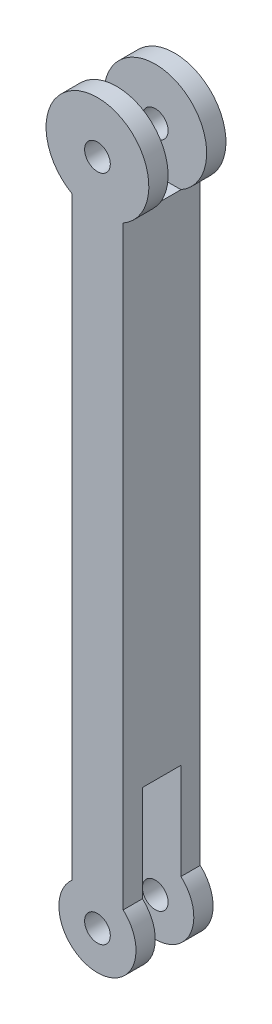
ISO-10303-21;
HEADER;
FILE_DESCRIPTION(('STEP AP214'),'2;1');
FILE_NAME('part.step','',(''),(''),'','','');
FILE_SCHEMA(('AUTOMOTIVE_DESIGN { 1 0 10303 214 1 1 1 1 }'));
ENDSEC;
DATA;
#1=APPLICATION_CONTEXT('core data for automotive mechanical design processes');
#2=APPLICATION_PROTOCOL_DEFINITION('international standard','automotive_design',2000,#1);
#3=PRODUCT_CONTEXT('',#1,'mechanical');
#4=PRODUCT('Part','Part','',(#3));
#5=PRODUCT_RELATED_PRODUCT_CATEGORY('part','',(#4));
#6=PRODUCT_DEFINITION_FORMATION('','',#4);
#7=PRODUCT_DEFINITION_CONTEXT('part definition',#1,'design');
#8=PRODUCT_DEFINITION('design','',#6,#7);
#9=PRODUCT_DEFINITION_SHAPE('','',#8);
#10=(LENGTH_UNIT() NAMED_UNIT(*) SI_UNIT(.MILLI.,.METRE.));
#11=(NAMED_UNIT(*) PLANE_ANGLE_UNIT() SI_UNIT($,.RADIAN.));
#12=(NAMED_UNIT(*) SI_UNIT($,.STERADIAN.) SOLID_ANGLE_UNIT());
#13=UNCERTAINTY_MEASURE_WITH_UNIT(LENGTH_MEASURE(1.E-05),#10,'distance_accuracy_value','');
#14=(GEOMETRIC_REPRESENTATION_CONTEXT(3) GLOBAL_UNCERTAINTY_ASSIGNED_CONTEXT((#13)) GLOBAL_UNIT_ASSIGNED_CONTEXT((#10,
#11,#12)) REPRESENTATION_CONTEXT('',''));
#15=CARTESIAN_POINT('',(0.,0.,0.));
#16=DIRECTION('',(0.,0.,1.));
#17=DIRECTION('',(1.,0.,0.));
#18=AXIS2_PLACEMENT_3D('',#15,#16,#17);
#19=CARTESIAN_POINT('',(0.,53.2280336376379,12.));
#20=DIRECTION('',(0.,0.,-1.));
#21=DIRECTION('',(-1.,0.,0.));
#22=AXIS2_PLACEMENT_3D('',#19,#20,#21);
#23=CYLINDRICAL_SURFACE('',#22,8.);
#24=CARTESIAN_POINT('',(0.,53.2280336376379,9.));
#25=DIRECTION('',(0.,0.,-1.));
#26=DIRECTION('',(-1.,0.,0.));
#27=AXIS2_PLACEMENT_3D('',#24,#25,#26);
#28=CIRCLE('',#27,8.);
#29=CARTESIAN_POINT('',(-4.00000000000001,46.2998304073624,9.));
#30=VERTEX_POINT('',#29);
#31=CARTESIAN_POINT('',(4.00000000000001,46.2998304073624,9.));
#32=VERTEX_POINT('',#31);
#33=EDGE_CURVE('E192',#30,#32,#28,.T.);
#34=ORIENTED_EDGE('',*,*,#33,.F.);
#35=DIRECTION('',(0.,0.,-1.));
#36=VECTOR('',#35,1.);
#37=CARTESIAN_POINT('',(-4.00000000000001,46.2998304073624,12.));
#38=LINE('',#37,#36);
#39=CARTESIAN_POINT('',(-4.00000000000001,46.2998304073624,12.));
#40=VERTEX_POINT('',#39);
#41=EDGE_CURVE('E11',#40,#30,#38,.T.);
#42=ORIENTED_EDGE('',*,*,#41,.F.);
#43=CARTESIAN_POINT('',(0.,53.2280336376379,12.));
#44=DIRECTION('',(0.,0.,1.));
#45=DIRECTION('',(-1.,0.,0.));
#46=AXIS2_PLACEMENT_3D('',#43,#44,#45);
#47=CIRCLE('',#46,8.);
#48=CARTESIAN_POINT('',(4.00000000000001,46.2998304073624,12.));
#49=VERTEX_POINT('',#48);
#50=EDGE_CURVE('E237',#49,#40,#47,.T.);
#51=ORIENTED_EDGE('',*,*,#50,.F.);
#52=DIRECTION('',(0.,0.,-1.));
#53=VECTOR('',#52,1.);
#54=CARTESIAN_POINT('',(4.00000000000001,46.2998304073624,12.));
#55=LINE('',#54,#53);
#56=EDGE_CURVE('E126',#49,#32,#55,.T.);
#57=ORIENTED_EDGE('',*,*,#56,.T.);
#58=EDGE_LOOP('',(#34,#42,#51,#57));
#59=FACE_BOUND('',#58,.T.);
#60=ADVANCED_FACE('F32',(#59),#23,.T.);
#61=CARTESIAN_POINT('',(0.,53.2280336376379,3.));
#62=DIRECTION('',(0.,0.,1.));
#63=DIRECTION('',(1.,0.,0.));
#64=AXIS2_PLACEMENT_3D('',#61,#62,#63);
#65=CIRCLE('',#64,8.);
#66=CARTESIAN_POINT('',(4.00000000000001,46.2998304073624,3.));
#67=VERTEX_POINT('',#66);
#68=CARTESIAN_POINT('',(-4.00000000000001,46.2998304073624,3.));
#69=VERTEX_POINT('',#68);
#70=EDGE_CURVE('E130',#67,#69,#65,.T.);
#71=ORIENTED_EDGE('',*,*,#70,.F.);
#72=CARTESIAN_POINT('',(4.00000000000001,46.2998304073624,0.));
#73=VERTEX_POINT('',#72);
#74=EDGE_CURVE('E79',#67,#73,#55,.T.);
#75=ORIENTED_EDGE('',*,*,#74,.T.);
#76=CARTESIAN_POINT('',(0.,53.2280336376379,0.));
#77=DIRECTION('',(0.,0.,1.));
#78=DIRECTION('',(-1.,0.,0.));
#79=AXIS2_PLACEMENT_3D('',#76,#77,#78);
#80=CIRCLE('',#79,8.);
#81=CARTESIAN_POINT('',(-4.00000000000001,46.2998304073624,0.));
#82=VERTEX_POINT('',#81);
#83=EDGE_CURVE('E234',#73,#82,#80,.T.);
#84=ORIENTED_EDGE('',*,*,#83,.T.);
#85=EDGE_CURVE('E40',#69,#82,#38,.T.);
#86=ORIENTED_EDGE('',*,*,#85,.F.);
#87=EDGE_LOOP('',(#71,#75,#84,#86));
#88=FACE_BOUND('',#87,.T.);
#89=ADVANCED_FACE('F133',(#88),#23,.T.);
#90=CARTESIAN_POINT('',(0.,53.2280336376379,0.));
#91=DIRECTION('',(0.,0.,1.));
#92=DIRECTION('',(1.,0.,0.));
#93=AXIS2_PLACEMENT_3D('',#90,#91,#92);
#94=CYLINDRICAL_SURFACE('',#93,2.);
#95=CARTESIAN_POINT('',(0.,53.2280336376379,12.));
#96=DIRECTION('',(0.,0.,1.));
#97=DIRECTION('',(1.,0.,0.));
#98=AXIS2_PLACEMENT_3D('',#95,#96,#97);
#99=CIRCLE('',#98,2.);
#100=CARTESIAN_POINT('',(2.,53.2280336376379,12.));
#101=VERTEX_POINT('',#100);
#102=EDGE_CURVE('E228',#101,#101,#99,.T.);
#103=ORIENTED_EDGE('',*,*,#102,.T.);
#104=EDGE_LOOP('',(#103));
#105=FACE_BOUND('',#104,.T.);
#106=CARTESIAN_POINT('',(0.,53.2280336376379,9.));
#107=DIRECTION('',(0.,0.,-1.));
#108=DIRECTION('',(-1.,0.,0.));
#109=AXIS2_PLACEMENT_3D('',#106,#107,#108);
#110=CIRCLE('',#109,2.);
#111=CARTESIAN_POINT('',(-2.,53.2280336376379,9.));
#112=VERTEX_POINT('',#111);
#113=EDGE_CURVE('E35',#112,#112,#110,.F.);
#114=ORIENTED_EDGE('',*,*,#113,.F.);
#115=EDGE_LOOP('',(#114));
#116=FACE_BOUND('',#115,.T.);
#117=ADVANCED_FACE('F172',(#105,#116),#94,.F.);
#118=CARTESIAN_POINT('',(0.,53.2280336376379,0.));
#119=DIRECTION('',(0.,0.,1.));
#120=DIRECTION('',(1.,0.,0.));
#121=AXIS2_PLACEMENT_3D('',#118,#119,#120);
#122=CIRCLE('',#121,2.);
#123=CARTESIAN_POINT('',(2.,53.2280336376379,0.));
#124=VERTEX_POINT('',#123);
#125=EDGE_CURVE('E231',#124,#124,#122,.T.);
#126=ORIENTED_EDGE('',*,*,#125,.F.);
#127=EDGE_LOOP('',(#126));
#128=FACE_BOUND('',#127,.T.);
#129=CARTESIAN_POINT('',(0.,53.2280336376379,3.));
#130=DIRECTION('',(0.,0.,1.));
#131=DIRECTION('',(1.,0.,0.));
#132=AXIS2_PLACEMENT_3D('',#129,#130,#131);
#133=CIRCLE('',#132,2.);
#134=CARTESIAN_POINT('',(2.,53.2280336376379,3.));
#135=VERTEX_POINT('',#134);
#136=EDGE_CURVE('E131',#135,#135,#133,.F.);
#137=ORIENTED_EDGE('',*,*,#136,.F.);
#138=EDGE_LOOP('',(#137));
#139=FACE_BOUND('',#138,.T.);
#140=ADVANCED_FACE('F169',(#128,#139),#94,.F.);
#141=CARTESIAN_POINT('',(0.,-50.771966362362,12.));
#142=DIRECTION('',(0.,0.,-1.));
#143=DIRECTION('',(-1.,0.,0.));
#144=AXIS2_PLACEMENT_3D('',#141,#142,#143);
#145=CYLINDRICAL_SURFACE('',#144,6.00000000000002);
#146=DIRECTION('',(0.,0.,-1.));
#147=VECTOR('',#146,1.);
#148=CARTESIAN_POINT('',(4.00000000000002,-46.2998304073625,12.));
#149=LINE('',#148,#147);
#150=CARTESIAN_POINT('',(3.99999999999998,-46.2998304073625,3.));
#151=VERTEX_POINT('',#150);
#152=CARTESIAN_POINT('',(4.00000000000002,-46.2998304073625,0.));
#153=VERTEX_POINT('',#152);
#154=EDGE_CURVE('E145',#151,#153,#149,.T.);
#155=ORIENTED_EDGE('',*,*,#154,.F.);
#156=CARTESIAN_POINT('',(0.,-50.771966362362,3.));
#157=DIRECTION('',(0.,0.,-1.));
#158=DIRECTION('',(-1.,0.,0.));
#159=AXIS2_PLACEMENT_3D('',#156,#157,#158);
#160=CIRCLE('',#159,6.00000000000002);
#161=CARTESIAN_POINT('',(-4.00000000000001,-46.2998304073624,3.));
#162=VERTEX_POINT('',#161);
#163=EDGE_CURVE('E164',#151,#162,#160,.T.);
#164=ORIENTED_EDGE('',*,*,#163,.T.);
#165=DIRECTION('',(0.,0.,-1.));
#166=VECTOR('',#165,1.);
#167=CARTESIAN_POINT('',(-4.,-46.2998304073624,12.));
#168=LINE('',#167,#166);
#169=CARTESIAN_POINT('',(-4.,-46.2998304073624,0.));
#170=VERTEX_POINT('',#169);
#171=EDGE_CURVE('E152',#162,#170,#168,.T.);
#172=ORIENTED_EDGE('',*,*,#171,.T.);
#173=CARTESIAN_POINT('',(0.,-50.771966362362,0.));
#174=DIRECTION('',(0.,0.,1.));
#175=DIRECTION('',(1.,0.,0.));
#176=AXIS2_PLACEMENT_3D('',#173,#174,#175);
#177=CIRCLE('',#176,6.00000000000002);
#178=EDGE_CURVE('E244',#170,#153,#177,.T.);
#179=ORIENTED_EDGE('',*,*,#178,.T.);
#180=EDGE_LOOP('',(#155,#164,#172,#179));
#181=FACE_BOUND('',#180,.T.);
#182=ADVANCED_FACE('F171',(#181),#145,.T.);
#183=CARTESIAN_POINT('',(0.,-50.7719663623621,0.));
#184=DIRECTION('',(0.,0.,1.));
#185=DIRECTION('',(1.,0.,0.));
#186=AXIS2_PLACEMENT_3D('',#183,#184,#185);
#187=CYLINDRICAL_SURFACE('',#186,2.);
#188=CARTESIAN_POINT('',(0.,-50.7719663623621,3.));
#189=DIRECTION('',(0.,0.,-1.));
#190=DIRECTION('',(-1.,0.,0.));
#191=AXIS2_PLACEMENT_3D('',#188,#189,#190);
#192=CIRCLE('',#191,2.);
#193=CARTESIAN_POINT('',(-1.99999999999999,-50.7719663623621,3.));
#194=VERTEX_POINT('',#193);
#195=EDGE_CURVE('E162',#194,#194,#192,.F.);
#196=ORIENTED_EDGE('',*,*,#195,.T.);
#197=EDGE_LOOP('',(#196));
#198=FACE_BOUND('',#197,.T.);
#199=CARTESIAN_POINT('',(0.,-50.7719663623621,0.));
#200=DIRECTION('',(0.,0.,1.));
#201=DIRECTION('',(1.,0.,0.));
#202=AXIS2_PLACEMENT_3D('',#199,#200,#201);
#203=CIRCLE('',#202,2.);
#204=CARTESIAN_POINT('',(2.00000000000001,-50.7719663623621,0.));
#205=VERTEX_POINT('',#204);
#206=EDGE_CURVE('E225',#205,#205,#203,.T.);
#207=ORIENTED_EDGE('',*,*,#206,.F.);
#208=EDGE_LOOP('',(#207));
#209=FACE_BOUND('',#208,.T.);
#210=ADVANCED_FACE('F179',(#198,#209),#187,.F.);
#211=CARTESIAN_POINT('',(-4.00000000000001,46.2998304073624,12.));
#212=DIRECTION('',(1.,0.,0.));
#213=DIRECTION('',(0.,1.,0.));
#214=AXIS2_PLACEMENT_3D('',#211,#212,#213);
#215=PLANE('',#214);
#216=DIRECTION('',(0.,0.,-1.));
#217=VECTOR('',#216,1.);
#218=CARTESIAN_POINT('',(-4.,-31.2998304073624,9.));
#219=LINE('',#218,#217);
#220=CARTESIAN_POINT('',(-4.,-31.2998304073624,9.));
#221=VERTEX_POINT('',#220);
#222=CARTESIAN_POINT('',(-4.,-31.2998304073624,3.));
#223=VERTEX_POINT('',#222);
#224=EDGE_CURVE('E200',#221,#223,#219,.T.);
#225=ORIENTED_EDGE('',*,*,#224,.F.);
#226=DIRECTION('',(0.,-1.,0.));
#227=VECTOR('',#226,1.);
#228=CARTESIAN_POINT('',(-4.,-31.2998304073624,9.));
#229=LINE('',#228,#227);
#230=CARTESIAN_POINT('',(-4.00000000000001,-46.2998304073624,9.));
#231=VERTEX_POINT('',#230);
#232=EDGE_CURVE('E161',#221,#231,#229,.T.);
#233=ORIENTED_EDGE('',*,*,#232,.T.);
#234=CARTESIAN_POINT('',(-4.,-46.2998304073624,12.));
#235=VERTEX_POINT('',#234);
#236=EDGE_CURVE('E154',#235,#231,#168,.T.);
#237=ORIENTED_EDGE('',*,*,#236,.F.);
#238=DIRECTION('',(0.,-1.,0.));
#239=VECTOR('',#238,1.);
#240=CARTESIAN_POINT('',(-4.00000000000001,46.2998304073624,12.));
#241=LINE('',#240,#239);
#242=EDGE_CURVE('E86',#40,#235,#241,.T.);
#243=ORIENTED_EDGE('',*,*,#242,.F.);
#244=ORIENTED_EDGE('',*,*,#41,.T.);
#245=DIRECTION('',(0.,0.,-1.));
#246=VECTOR('',#245,1.);
#247=CARTESIAN_POINT('',(-4.00000000000001,46.2998304073624,12.));
#248=LINE('',#247,#246);
#249=EDGE_CURVE('E194',#30,#69,#248,.T.);
#250=ORIENTED_EDGE('',*,*,#249,.T.);
#251=ORIENTED_EDGE('',*,*,#85,.T.);
#252=DIRECTION('',(0.,-1.,0.));
#253=VECTOR('',#252,1.);
#254=CARTESIAN_POINT('',(-4.00000000000001,46.2998304073624,0.));
#255=LINE('',#254,#253);
#256=EDGE_CURVE('E242',#82,#170,#255,.T.);
#257=ORIENTED_EDGE('',*,*,#256,.T.);
#258=ORIENTED_EDGE('',*,*,#171,.F.);
#259=DIRECTION('',(0.,-1.,0.));
#260=VECTOR('',#259,1.);
#261=CARTESIAN_POINT('',(-4.,-31.2998304073624,3.));
#262=LINE('',#261,#260);
#263=EDGE_CURVE('E213',#223,#162,#262,.T.);
#264=ORIENTED_EDGE('',*,*,#263,.F.);
#265=EDGE_LOOP('',(#225,#233,#237,#243,#244,#250,#251,#257,#258,#264));
#266=FACE_BOUND('',#265,.T.);
#267=ADVANCED_FACE('F197',(#266),#215,.F.);
#268=ORIENTED_EDGE('',*,*,#236,.T.);
#269=CARTESIAN_POINT('',(0.,-50.771966362362,9.));
#270=DIRECTION('',(0.,0.,1.));
#271=DIRECTION('',(1.,0.,0.));
#272=AXIS2_PLACEMENT_3D('',#269,#270,#271);
#273=CIRCLE('',#272,6.00000000000002);
#274=CARTESIAN_POINT('',(4.00000000000003,-46.2998304073625,9.));
#275=VERTEX_POINT('',#274);
#276=EDGE_CURVE('E160',#231,#275,#273,.T.);
#277=ORIENTED_EDGE('',*,*,#276,.T.);
#278=CARTESIAN_POINT('',(4.00000000000002,-46.2998304073625,12.));
#279=VERTEX_POINT('',#278);
#280=EDGE_CURVE('E149',#279,#275,#149,.T.);
#281=ORIENTED_EDGE('',*,*,#280,.F.);
#282=CARTESIAN_POINT('',(0.,-50.771966362362,12.));
#283=DIRECTION('',(0.,0.,1.));
#284=DIRECTION('',(1.,0.,0.));
#285=AXIS2_PLACEMENT_3D('',#282,#283,#284);
#286=CIRCLE('',#285,6.00000000000002);
#287=EDGE_CURVE('E141',#235,#279,#286,.T.);
#288=ORIENTED_EDGE('',*,*,#287,.F.);
#289=EDGE_LOOP('',(#268,#277,#281,#288));
#290=FACE_BOUND('',#289,.T.);
#291=ADVANCED_FACE('F182',(#290),#145,.T.);
#292=CARTESIAN_POINT('',(4.00000000000001,46.2998304073624,12.));
#293=DIRECTION('',(-1.,0.,0.));
#294=DIRECTION('',(0.,-1.,0.));
#295=AXIS2_PLACEMENT_3D('',#292,#293,#294);
#296=PLANE('',#295);
#297=ORIENTED_EDGE('',*,*,#280,.T.);
#298=DIRECTION('',(0.,-1.,0.));
#299=VECTOR('',#298,1.);
#300=CARTESIAN_POINT('',(3.99999999999999,-31.2998304073625,9.));
#301=LINE('',#300,#299);
#302=CARTESIAN_POINT('',(3.99999999999999,-31.2998304073625,9.));
#303=VERTEX_POINT('',#302);
#304=EDGE_CURVE('E215',#303,#275,#301,.T.);
#305=ORIENTED_EDGE('',*,*,#304,.F.);
#306=DIRECTION('',(0.,0.,1.));
#307=VECTOR('',#306,1.);
#308=CARTESIAN_POINT('',(3.99999999999999,-31.2998304073625,9.));
#309=LINE('',#308,#307);
#310=CARTESIAN_POINT('',(3.99999999999999,-31.2998304073625,3.));
#311=VERTEX_POINT('',#310);
#312=EDGE_CURVE('E208',#311,#303,#309,.T.);
#313=ORIENTED_EDGE('',*,*,#312,.F.);
#314=DIRECTION('',(0.,-1.,0.));
#315=VECTOR('',#314,1.);
#316=CARTESIAN_POINT('',(3.99999999999999,-31.2998304073625,3.));
#317=LINE('',#316,#315);
#318=EDGE_CURVE('E217',#311,#151,#317,.T.);
#319=ORIENTED_EDGE('',*,*,#318,.T.);
#320=ORIENTED_EDGE('',*,*,#154,.T.);
#321=DIRECTION('',(0.,1.,0.));
#322=VECTOR('',#321,1.);
#323=CARTESIAN_POINT('',(4.00000000000001,46.2998304073624,0.));
#324=LINE('',#323,#322);
#325=EDGE_CURVE('E139',#153,#73,#324,.T.);
#326=ORIENTED_EDGE('',*,*,#325,.T.);
#327=ORIENTED_EDGE('',*,*,#74,.F.);
#328=EDGE_CURVE('E119',#32,#67,#55,.T.);
#329=ORIENTED_EDGE('',*,*,#328,.F.);
#330=ORIENTED_EDGE('',*,*,#56,.F.);
#331=DIRECTION('',(0.,1.,0.));
#332=VECTOR('',#331,1.);
#333=CARTESIAN_POINT('',(4.00000000000001,46.2998304073624,12.));
#334=LINE('',#333,#332);
#335=EDGE_CURVE('E57',#279,#49,#334,.T.);
#336=ORIENTED_EDGE('',*,*,#335,.F.);
#337=EDGE_LOOP('',(#297,#305,#313,#319,#320,#326,#327,#329,#330,#336));
#338=FACE_BOUND('',#337,.T.);
#339=ADVANCED_FACE('F137',(#338),#296,.F.);
#340=CARTESIAN_POINT('',(0.,53.2280336376379,12.));
#341=DIRECTION('',(0.,0.,-1.));
#342=DIRECTION('',(-1.,0.,0.));
#343=AXIS2_PLACEMENT_3D('',#340,#341,#342);
#344=PLANE('',#343);
#345=CARTESIAN_POINT('',(0.,-50.7719663623621,12.));
#346=DIRECTION('',(0.,0.,1.));
#347=DIRECTION('',(1.,0.,0.));
#348=AXIS2_PLACEMENT_3D('',#345,#346,#347);
#349=CIRCLE('',#348,2.);
#350=CARTESIAN_POINT('',(2.00000000000001,-50.7719663623621,12.));
#351=VERTEX_POINT('',#350);
#352=EDGE_CURVE('E224',#351,#351,#349,.T.);
#353=ORIENTED_EDGE('',*,*,#352,.F.);
#354=EDGE_LOOP('',(#353));
#355=FACE_BOUND('',#354,.T.);
#356=ORIENTED_EDGE('',*,*,#102,.F.);
#357=EDGE_LOOP('',(#356));
#358=FACE_BOUND('',#357,.T.);
#359=ORIENTED_EDGE('',*,*,#50,.T.);
#360=ORIENTED_EDGE('',*,*,#242,.T.);
#361=ORIENTED_EDGE('',*,*,#287,.T.);
#362=ORIENTED_EDGE('',*,*,#335,.T.);
#363=EDGE_LOOP('',(#359,#360,#361,#362));
#364=FACE_BOUND('',#363,.T.);
#365=ADVANCED_FACE('F264',(#355,#358,#364),#344,.F.);
#366=CARTESIAN_POINT('',(0.,53.2280336376379,0.));
#367=DIRECTION('',(0.,0.,-1.));
#368=DIRECTION('',(-1.,0.,0.));
#369=AXIS2_PLACEMENT_3D('',#366,#367,#368);
#370=PLANE('',#369);
#371=ORIENTED_EDGE('',*,*,#206,.T.);
#372=EDGE_LOOP('',(#371));
#373=FACE_BOUND('',#372,.T.);
#374=ORIENTED_EDGE('',*,*,#125,.T.);
#375=EDGE_LOOP('',(#374));
#376=FACE_BOUND('',#375,.T.);
#377=ORIENTED_EDGE('',*,*,#83,.F.);
#378=ORIENTED_EDGE('',*,*,#325,.F.);
#379=ORIENTED_EDGE('',*,*,#178,.F.);
#380=ORIENTED_EDGE('',*,*,#256,.F.);
#381=EDGE_LOOP('',(#377,#378,#379,#380));
#382=FACE_BOUND('',#381,.T.);
#383=ADVANCED_FACE('F248',(#373,#376,#382),#370,.T.);
#384=CARTESIAN_POINT('',(0.,-50.7719663623621,9.));
#385=DIRECTION('',(0.,0.,1.));
#386=DIRECTION('',(1.,0.,0.));
#387=AXIS2_PLACEMENT_3D('',#384,#385,#386);
#388=CIRCLE('',#387,2.);
#389=CARTESIAN_POINT('',(2.00000000000001,-50.7719663623621,9.));
#390=VERTEX_POINT('',#389);
#391=EDGE_CURVE('E157',#390,#390,#388,.F.);
#392=ORIENTED_EDGE('',*,*,#391,.T.);
#393=EDGE_LOOP('',(#392));
#394=FACE_BOUND('',#393,.T.);
#395=ORIENTED_EDGE('',*,*,#352,.T.);
#396=EDGE_LOOP('',(#395));
#397=FACE_BOUND('',#396,.T.);
#398=ADVANCED_FACE('F271',(#394,#397),#187,.F.);
#399=CARTESIAN_POINT('',(15.,-60.2998304073625,3.));
#400=DIRECTION('',(0.,0.,-1.));
#401=DIRECTION('',(-1.,0.,0.));
#402=AXIS2_PLACEMENT_3D('',#399,#400,#401);
#403=PLANE('',#402);
#404=ORIENTED_EDGE('',*,*,#195,.F.);
#405=EDGE_LOOP('',(#404));
#406=FACE_BOUND('',#405,.T.);
#407=ORIENTED_EDGE('',*,*,#163,.F.);
#408=ORIENTED_EDGE('',*,*,#318,.F.);
#409=DIRECTION('',(1.,0.,0.));
#410=VECTOR('',#409,1.);
#411=CARTESIAN_POINT('',(-4.,-31.2998304073624,3.));
#412=LINE('',#411,#410);
#413=EDGE_CURVE('E203',#223,#311,#412,.T.);
#414=ORIENTED_EDGE('',*,*,#413,.F.);
#415=ORIENTED_EDGE('',*,*,#263,.T.);
#416=EDGE_LOOP('',(#407,#408,#414,#415));
#417=FACE_BOUND('',#416,.T.);
#418=ADVANCED_FACE('F252',(#406,#417),#403,.F.);
#419=CARTESIAN_POINT('',(15.,-60.2998304073625,9.));
#420=DIRECTION('',(0.,0.,1.));
#421=DIRECTION('',(1.,0.,0.));
#422=AXIS2_PLACEMENT_3D('',#419,#420,#421);
#423=PLANE('',#422);
#424=ORIENTED_EDGE('',*,*,#391,.F.);
#425=EDGE_LOOP('',(#424));
#426=FACE_BOUND('',#425,.T.);
#427=ORIENTED_EDGE('',*,*,#276,.F.);
#428=ORIENTED_EDGE('',*,*,#232,.F.);
#429=DIRECTION('',(-1.,0.,0.));
#430=VECTOR('',#429,1.);
#431=CARTESIAN_POINT('',(-4.,-31.2998304073624,9.));
#432=LINE('',#431,#430);
#433=EDGE_CURVE('E210',#303,#221,#432,.T.);
#434=ORIENTED_EDGE('',*,*,#433,.F.);
#435=ORIENTED_EDGE('',*,*,#304,.T.);
#436=EDGE_LOOP('',(#427,#428,#434,#435));
#437=FACE_BOUND('',#436,.T.);
#438=ADVANCED_FACE('F260',(#426,#437),#423,.F.);
#439=CARTESIAN_POINT('',(0.,-31.2998304073624,0.));
#440=DIRECTION('',(0.,-1.,0.));
#441=DIRECTION('',(1.,0.,0.));
#442=AXIS2_PLACEMENT_3D('',#439,#440,#441);
#443=PLANE('',#442);
#444=ORIENTED_EDGE('',*,*,#224,.T.);
#445=ORIENTED_EDGE('',*,*,#413,.T.);
#446=ORIENTED_EDGE('',*,*,#312,.T.);
#447=ORIENTED_EDGE('',*,*,#433,.T.);
#448=EDGE_LOOP('',(#444,#445,#446,#447));
#449=FACE_BOUND('',#448,.T.);
#450=ADVANCED_FACE('F255',(#449),#443,.T.);
#451=CARTESIAN_POINT('',(0.,46.2998304073624,0.));
#452=DIRECTION('',(0.,-1.,0.));
#453=DIRECTION('',(0.,0.,-1.));
#454=AXIS2_PLACEMENT_3D('',#451,#452,#453);
#455=PLANE('',#454);
#456=DIRECTION('',(1.,0.,0.));
#457=VECTOR('',#456,1.);
#458=CARTESIAN_POINT('',(15.,46.2998304073624,9.));
#459=LINE('',#458,#457);
#460=EDGE_CURVE('E48',#30,#32,#459,.T.);
#461=ORIENTED_EDGE('',*,*,#460,.T.);
#462=ORIENTED_EDGE('',*,*,#328,.T.);
#463=DIRECTION('',(-1.,0.,0.));
#464=VECTOR('',#463,1.);
#465=CARTESIAN_POINT('',(15.,46.2998304073624,3.));
#466=LINE('',#465,#464);
#467=EDGE_CURVE('E122',#67,#69,#466,.T.);
#468=ORIENTED_EDGE('',*,*,#467,.T.);
#469=ORIENTED_EDGE('',*,*,#249,.F.);
#470=EDGE_LOOP('',(#461,#462,#468,#469));
#471=FACE_BOUND('',#470,.T.);
#472=ADVANCED_FACE('F121',(#471),#455,.F.);
#473=CARTESIAN_POINT('',(15.,85.2998304073624,9.));
#474=DIRECTION('',(0.,0.,-1.));
#475=DIRECTION('',(-1.,0.,0.));
#476=AXIS2_PLACEMENT_3D('',#473,#474,#475);
#477=PLANE('',#476);
#478=ORIENTED_EDGE('',*,*,#113,.T.);
#479=EDGE_LOOP('',(#478));
#480=FACE_BOUND('',#479,.T.);
#481=ORIENTED_EDGE('',*,*,#33,.T.);
#482=ORIENTED_EDGE('',*,*,#460,.F.);
#483=EDGE_LOOP('',(#481,#482));
#484=FACE_BOUND('',#483,.T.);
#485=ADVANCED_FACE('F303',(#480,#484),#477,.T.);
#486=CARTESIAN_POINT('',(15.,85.2998304073624,3.));
#487=DIRECTION('',(0.,0.,1.));
#488=DIRECTION('',(1.,0.,0.));
#489=AXIS2_PLACEMENT_3D('',#486,#487,#488);
#490=PLANE('',#489);
#491=ORIENTED_EDGE('',*,*,#136,.T.);
#492=EDGE_LOOP('',(#491));
#493=FACE_BOUND('',#492,.T.);
#494=ORIENTED_EDGE('',*,*,#70,.T.);
#495=ORIENTED_EDGE('',*,*,#467,.F.);
#496=EDGE_LOOP('',(#494,#495));
#497=FACE_BOUND('',#496,.T.);
#498=ADVANCED_FACE('F129',(#493,#497),#490,.T.);
#499=CLOSED_SHELL('',(#60,#89,#117,#140,#182,#210,#267,#291,#339,#365,#383,#398,#418,#438,#450,
#472,#485,#498));
#500=MANIFOLD_SOLID_BREP('B2',#499);
#501=ADVANCED_BREP_SHAPE_REPRESENTATION('',(#18,#500),#14);
#502=SHAPE_DEFINITION_REPRESENTATION(#9,#501);
ENDSEC;
END-ISO-10303-21;
